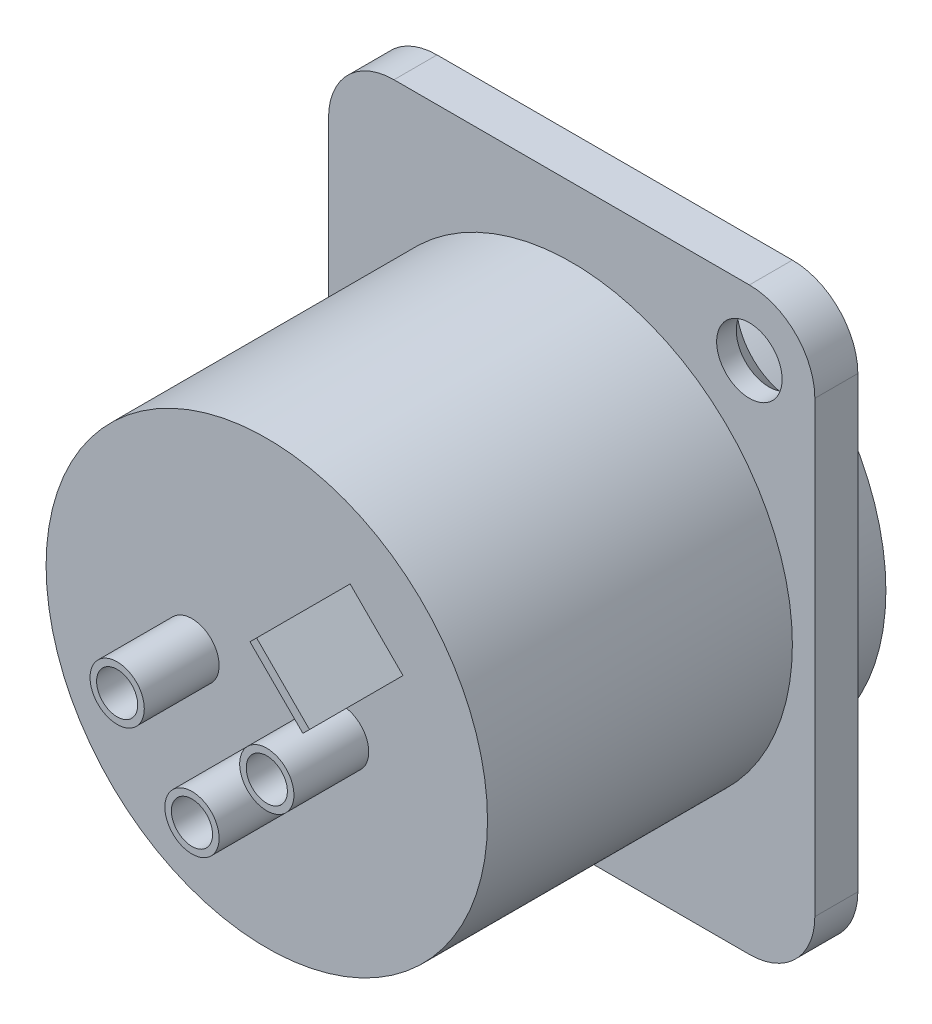
ISO-10303-21;
HEADER;
FILE_DESCRIPTION(('STEP AP214'),'2;1');
FILE_NAME('part.step','',(''),(''),'','','');
FILE_SCHEMA(('AUTOMOTIVE_DESIGN { 1 0 10303 214 1 1 1 1 }'));
ENDSEC;
DATA;
#1=APPLICATION_CONTEXT('core data for automotive mechanical design processes');
#2=APPLICATION_PROTOCOL_DEFINITION('international standard','automotive_design',2000,#1);
#3=PRODUCT_CONTEXT('',#1,'mechanical');
#4=PRODUCT('Part','Part','',(#3));
#5=PRODUCT_RELATED_PRODUCT_CATEGORY('part','',(#4));
#6=PRODUCT_DEFINITION_FORMATION('','',#4);
#7=PRODUCT_DEFINITION_CONTEXT('part definition',#1,'design');
#8=PRODUCT_DEFINITION('design','',#6,#7);
#9=PRODUCT_DEFINITION_SHAPE('','',#8);
#10=(LENGTH_UNIT() NAMED_UNIT(*) SI_UNIT(.MILLI.,.METRE.));
#11=(NAMED_UNIT(*) PLANE_ANGLE_UNIT() SI_UNIT($,.RADIAN.));
#12=(NAMED_UNIT(*) SI_UNIT($,.STERADIAN.) SOLID_ANGLE_UNIT());
#13=UNCERTAINTY_MEASURE_WITH_UNIT(LENGTH_MEASURE(1.E-05),#10,'distance_accuracy_value','');
#14=(GEOMETRIC_REPRESENTATION_CONTEXT(3) GLOBAL_UNCERTAINTY_ASSIGNED_CONTEXT((#13)) GLOBAL_UNIT_ASSIGNED_CONTEXT((#10,
#11,#12)) REPRESENTATION_CONTEXT('',''));
#15=CARTESIAN_POINT('',(0.,0.,0.));
#16=DIRECTION('',(0.,0.,1.));
#17=DIRECTION('',(1.,0.,0.));
#18=AXIS2_PLACEMENT_3D('',#15,#16,#17);
#19=CARTESIAN_POINT('',(0.,0.,18.6));
#20=DIRECTION('',(0.,0.,-1.));
#21=DIRECTION('',(-1.,0.,0.));
#22=AXIS2_PLACEMENT_3D('',#19,#20,#21);
#23=PLANE('',#22);
#24=CARTESIAN_POINT('',(-4.,0.,18.6));
#25=DIRECTION('',(0.,0.,1.));
#26=DIRECTION('',(1.,0.,0.));
#27=AXIS2_PLACEMENT_3D('',#24,#25,#26);
#28=CIRCLE('',#27,1.1);
#29=CARTESIAN_POINT('',(-2.9,0.,18.6));
#30=VERTEX_POINT('',#29);
#31=EDGE_CURVE('E18',#30,#30,#28,.T.);
#32=ORIENTED_EDGE('',*,*,#31,.T.);
#33=EDGE_LOOP('',(#32));
#34=FACE_BOUND('',#33,.T.);
#35=ADVANCED_FACE('F15',(#34),#23,.F.);
#36=CARTESIAN_POINT('',(0.,0.,18.6));
#37=DIRECTION('',(0.,0.,-1.));
#38=DIRECTION('',(-1.,0.,0.));
#39=AXIS2_PLACEMENT_3D('',#36,#37,#38);
#40=PLANE('',#39);
#41=CARTESIAN_POINT('',(0.,-4.,18.6));
#42=DIRECTION('',(0.,0.,1.));
#43=DIRECTION('',(1.,0.,0.));
#44=AXIS2_PLACEMENT_3D('',#41,#42,#43);
#45=CIRCLE('',#44,1.1);
#46=CARTESIAN_POINT('',(1.1,-4.,18.6));
#47=VERTEX_POINT('',#46);
#48=EDGE_CURVE('E272',#47,#47,#45,.T.);
#49=ORIENTED_EDGE('',*,*,#48,.T.);
#50=EDGE_LOOP('',(#49));
#51=FACE_BOUND('',#50,.T.);
#52=ADVANCED_FACE('F294',(#51),#40,.F.);
#53=CARTESIAN_POINT('',(0.,0.,18.6));
#54=DIRECTION('',(0.,0.,-1.));
#55=DIRECTION('',(-1.,0.,0.));
#56=AXIS2_PLACEMENT_3D('',#53,#54,#55);
#57=PLANE('',#56);
#58=CARTESIAN_POINT('',(4.,0.,18.6));
#59=DIRECTION('',(0.,0.,1.));
#60=DIRECTION('',(1.,0.,0.));
#61=AXIS2_PLACEMENT_3D('',#58,#59,#60);
#62=CIRCLE('',#61,1.1);
#63=CARTESIAN_POINT('',(5.1,0.,18.6));
#64=VERTEX_POINT('',#63);
#65=EDGE_CURVE('E157',#64,#64,#62,.T.);
#66=ORIENTED_EDGE('',*,*,#65,.T.);
#67=EDGE_LOOP('',(#66));
#68=FACE_BOUND('',#67,.T.);
#69=ADVANCED_FACE('F283',(#68),#57,.F.);
#70=CARTESIAN_POINT('',(-4.,0.,18.6));
#71=DIRECTION('',(0.,0.,1.));
#72=DIRECTION('',(1.,0.,0.));
#73=AXIS2_PLACEMENT_3D('',#70,#71,#72);
#74=CYLINDRICAL_SURFACE('',#73,1.1);
#75=CARTESIAN_POINT('',(-4.,0.,22.6));
#76=DIRECTION('',(0.,0.,1.));
#77=DIRECTION('',(1.,0.,0.));
#78=AXIS2_PLACEMENT_3D('',#75,#76,#77);
#79=CIRCLE('',#78,1.1);
#80=CARTESIAN_POINT('',(-2.9,0.,22.6));
#81=VERTEX_POINT('',#80);
#82=EDGE_CURVE('E153',#81,#81,#79,.F.);
#83=ORIENTED_EDGE('',*,*,#82,.F.);
#84=EDGE_LOOP('',(#83));
#85=FACE_BOUND('',#84,.T.);
#86=ORIENTED_EDGE('',*,*,#31,.F.);
#87=EDGE_LOOP('',(#86));
#88=FACE_BOUND('',#87,.T.);
#89=ADVANCED_FACE('F280',(#85,#88),#74,.F.);
#90=CARTESIAN_POINT('',(0.,-4.,18.6));
#91=DIRECTION('',(0.,0.,1.));
#92=DIRECTION('',(1.,0.,0.));
#93=AXIS2_PLACEMENT_3D('',#90,#91,#92);
#94=CYLINDRICAL_SURFACE('',#93,1.1);
#95=CARTESIAN_POINT('',(0.,-4.,22.6));
#96=DIRECTION('',(0.,0.,1.));
#97=DIRECTION('',(1.,0.,0.));
#98=AXIS2_PLACEMENT_3D('',#95,#96,#97);
#99=CIRCLE('',#98,1.1);
#100=CARTESIAN_POINT('',(1.1,-4.,22.6));
#101=VERTEX_POINT('',#100);
#102=EDGE_CURVE('E266',#101,#101,#99,.F.);
#103=ORIENTED_EDGE('',*,*,#102,.F.);
#104=EDGE_LOOP('',(#103));
#105=FACE_BOUND('',#104,.T.);
#106=ORIENTED_EDGE('',*,*,#48,.F.);
#107=EDGE_LOOP('',(#106));
#108=FACE_BOUND('',#107,.T.);
#109=ADVANCED_FACE('F282',(#105,#108),#94,.F.);
#110=CARTESIAN_POINT('',(4.,0.,18.6));
#111=DIRECTION('',(0.,0.,1.));
#112=DIRECTION('',(1.,0.,0.));
#113=AXIS2_PLACEMENT_3D('',#110,#111,#112);
#114=CYLINDRICAL_SURFACE('',#113,1.1);
#115=CARTESIAN_POINT('',(4.,0.,22.6));
#116=DIRECTION('',(0.,0.,1.));
#117=DIRECTION('',(1.,0.,0.));
#118=AXIS2_PLACEMENT_3D('',#115,#116,#117);
#119=CIRCLE('',#118,1.1);
#120=CARTESIAN_POINT('',(5.1,0.,22.6));
#121=VERTEX_POINT('',#120);
#122=EDGE_CURVE('E143',#121,#121,#119,.F.);
#123=ORIENTED_EDGE('',*,*,#122,.F.);
#124=EDGE_LOOP('',(#123));
#125=FACE_BOUND('',#124,.T.);
#126=ORIENTED_EDGE('',*,*,#65,.F.);
#127=EDGE_LOOP('',(#126));
#128=FACE_BOUND('',#127,.T.);
#129=ADVANCED_FACE('F291',(#125,#128),#114,.F.);
#130=CARTESIAN_POINT('',(4.454772721475,7.283199846221,18.6));
#131=DIRECTION('',(-0.707106781186548,0.707106781186548,0.));
#132=DIRECTION('',(-0.707106781186548,-0.707106781186548,0.));
#133=AXIS2_PLACEMENT_3D('',#130,#131,#132);
#134=PLANE('',#133);
#135=DIRECTION('',(0.,0.,1.));
#136=VECTOR('',#135,1.);
#137=CARTESIAN_POINT('',(4.454772721475,7.283199846221,18.6));
#138=LINE('',#137,#136);
#139=CARTESIAN_POINT('',(4.454772721475,7.283199846221,18.6));
#140=VERTEX_POINT('',#139);
#141=CARTESIAN_POINT('',(4.454772721475,7.283199846221,23.6));
#142=VERTEX_POINT('',#141);
#143=EDGE_CURVE('E149',#140,#142,#138,.T.);
#144=ORIENTED_EDGE('',*,*,#143,.F.);
#145=DIRECTION('',(-0.707106781186548,-0.707106781186548,0.));
#146=VECTOR('',#145,1.);
#147=CARTESIAN_POINT('',(4.454772721475,7.283199846221,18.6));
#148=LINE('',#147,#146);
#149=CARTESIAN_POINT('',(4.101219330882,6.929646455628,18.6));
#150=VERTEX_POINT('',#149);
#151=EDGE_CURVE('E156',#140,#150,#148,.T.);
#152=ORIENTED_EDGE('',*,*,#151,.T.);
#153=DIRECTION('',(0.,0.,1.));
#154=VECTOR('',#153,1.);
#155=CARTESIAN_POINT('',(4.101219330882,6.929646455628,18.6));
#156=LINE('',#155,#154);
#157=CARTESIAN_POINT('',(4.101219330882,6.929646455628,23.6));
#158=VERTEX_POINT('',#157);
#159=EDGE_CURVE('E147',#158,#150,#156,.F.);
#160=ORIENTED_EDGE('',*,*,#159,.F.);
#161=DIRECTION('',(-0.707106781186547,-0.707106781186548,0.));
#162=VECTOR('',#161,1.);
#163=CARTESIAN_POINT('',(4.454772721475,7.283199846221,23.6));
#164=LINE('',#163,#162);
#165=EDGE_CURVE('E133',#142,#158,#164,.T.);
#166=ORIENTED_EDGE('',*,*,#165,.F.);
#167=EDGE_LOOP('',(#144,#152,#160,#166));
#168=FACE_BOUND('',#167,.T.);
#169=ADVANCED_FACE('F441',(#168),#134,.T.);
#170=CARTESIAN_POINT('',(0.,0.,23.6));
#171=DIRECTION('',(0.,0.,1.));
#172=DIRECTION('',(1.,0.,0.));
#173=AXIS2_PLACEMENT_3D('',#170,#171,#172);
#174=PLANE('',#173);
#175=DIRECTION('',(-0.707106781186548,0.707106781186548,0.));
#176=VECTOR('',#175,1.);
#177=CARTESIAN_POINT('',(7.283199846221,4.454772721475,23.6));
#178=LINE('',#177,#176);
#179=CARTESIAN_POINT('',(7.283199846221,4.454772721475,23.6));
#180=VERTEX_POINT('',#179);
#181=EDGE_CURVE('E473',#142,#180,#178,.F.);
#182=ORIENTED_EDGE('',*,*,#181,.F.);
#183=ORIENTED_EDGE('',*,*,#165,.T.);
#184=DIRECTION('',(0.707106781186548,-0.707106781186548,0.));
#185=VECTOR('',#184,1.);
#186=CARTESIAN_POINT('',(4.101219330882,6.929646455628,23.6));
#187=LINE('',#186,#185);
#188=CARTESIAN_POINT('',(6.929646455628,4.101219330882,23.6));
#189=VERTEX_POINT('',#188);
#190=EDGE_CURVE('E139',#189,#158,#187,.F.);
#191=ORIENTED_EDGE('',*,*,#190,.F.);
#192=DIRECTION('',(0.707106781186548,0.707106781186548,0.));
#193=VECTOR('',#192,1.);
#194=CARTESIAN_POINT('',(6.929646455628,4.101219330882,23.6));
#195=LINE('',#194,#193);
#196=EDGE_CURVE('E124',#180,#189,#195,.F.);
#197=ORIENTED_EDGE('',*,*,#196,.F.);
#198=EDGE_LOOP('',(#182,#183,#191,#197));
#199=FACE_BOUND('',#198,.T.);
#200=ADVANCED_FACE('F145',(#199),#174,.T.);
#201=CARTESIAN_POINT('',(6.929646455628,4.101219330882,18.6));
#202=DIRECTION('',(0.707106781186548,-0.707106781186548,0.));
#203=DIRECTION('',(0.707106781186548,0.707106781186548,0.));
#204=AXIS2_PLACEMENT_3D('',#201,#202,#203);
#205=PLANE('',#204);
#206=DIRECTION('',(0.,0.,1.));
#207=VECTOR('',#206,1.);
#208=CARTESIAN_POINT('',(6.929646455628,4.101219330882,18.6));
#209=LINE('',#208,#207);
#210=CARTESIAN_POINT('',(6.929646455628,4.101219330882,18.6));
#211=VERTEX_POINT('',#210);
#212=EDGE_CURVE('E127',#211,#189,#209,.T.);
#213=ORIENTED_EDGE('',*,*,#212,.F.);
#214=DIRECTION('',(0.707106781186548,0.707106781186548,0.));
#215=VECTOR('',#214,1.);
#216=CARTESIAN_POINT('',(6.929646455628,4.101219330882,18.6));
#217=LINE('',#216,#215);
#218=CARTESIAN_POINT('',(7.283199846221,4.454772721475,18.6));
#219=VERTEX_POINT('',#218);
#220=EDGE_CURVE('E103',#211,#219,#217,.T.);
#221=ORIENTED_EDGE('',*,*,#220,.T.);
#222=DIRECTION('',(0.,0.,1.));
#223=VECTOR('',#222,1.);
#224=CARTESIAN_POINT('',(7.283199846221,4.454772721475,18.6));
#225=LINE('',#224,#223);
#226=EDGE_CURVE('E129',#180,#219,#225,.F.);
#227=ORIENTED_EDGE('',*,*,#226,.F.);
#228=ORIENTED_EDGE('',*,*,#196,.T.);
#229=EDGE_LOOP('',(#213,#221,#227,#228));
#230=FACE_BOUND('',#229,.T.);
#231=ADVANCED_FACE('F126',(#230),#205,.T.);
#232=CARTESIAN_POINT('',(0.,0.,22.6));
#233=DIRECTION('',(0.,0.,1.));
#234=DIRECTION('',(1.,0.,0.));
#235=AXIS2_PLACEMENT_3D('',#232,#233,#234);
#236=PLANE('',#235);
#237=ORIENTED_EDGE('',*,*,#82,.T.);
#238=EDGE_LOOP('',(#237));
#239=FACE_BOUND('',#238,.T.);
#240=CARTESIAN_POINT('',(-4.,0.,22.6));
#241=DIRECTION('',(0.,0.,1.));
#242=DIRECTION('',(1.,0.,0.));
#243=AXIS2_PLACEMENT_3D('',#240,#241,#242);
#244=CIRCLE('',#243,1.45);
#245=CARTESIAN_POINT('',(-2.55,0.,22.6));
#246=VERTEX_POINT('',#245);
#247=EDGE_CURVE('E261',#246,#246,#244,.F.);
#248=ORIENTED_EDGE('',*,*,#247,.F.);
#249=EDGE_LOOP('',(#248));
#250=FACE_BOUND('',#249,.T.);
#251=ADVANCED_FACE('F432',(#239,#250),#236,.T.);
#252=CARTESIAN_POINT('',(0.,0.,22.6));
#253=DIRECTION('',(0.,0.,1.));
#254=DIRECTION('',(1.,0.,0.));
#255=AXIS2_PLACEMENT_3D('',#252,#253,#254);
#256=PLANE('',#255);
#257=ORIENTED_EDGE('',*,*,#102,.T.);
#258=EDGE_LOOP('',(#257));
#259=FACE_BOUND('',#258,.T.);
#260=CARTESIAN_POINT('',(0.,-4.,22.6));
#261=DIRECTION('',(0.,0.,1.));
#262=DIRECTION('',(1.,0.,0.));
#263=AXIS2_PLACEMENT_3D('',#260,#261,#262);
#264=CIRCLE('',#263,1.45);
#265=CARTESIAN_POINT('',(1.45,-4.,22.6));
#266=VERTEX_POINT('',#265);
#267=EDGE_CURVE('E258',#266,#266,#264,.F.);
#268=ORIENTED_EDGE('',*,*,#267,.F.);
#269=EDGE_LOOP('',(#268));
#270=FACE_BOUND('',#269,.T.);
#271=ADVANCED_FACE('F428',(#259,#270),#256,.T.);
#272=CARTESIAN_POINT('',(0.,0.,22.6));
#273=DIRECTION('',(0.,0.,1.));
#274=DIRECTION('',(1.,0.,0.));
#275=AXIS2_PLACEMENT_3D('',#272,#273,#274);
#276=PLANE('',#275);
#277=ORIENTED_EDGE('',*,*,#122,.T.);
#278=EDGE_LOOP('',(#277));
#279=FACE_BOUND('',#278,.T.);
#280=CARTESIAN_POINT('',(4.,0.,22.6));
#281=DIRECTION('',(0.,0.,1.));
#282=DIRECTION('',(1.,0.,0.));
#283=AXIS2_PLACEMENT_3D('',#280,#281,#282);
#284=CIRCLE('',#283,1.45);
#285=CARTESIAN_POINT('',(5.45,0.,22.6));
#286=VERTEX_POINT('',#285);
#287=EDGE_CURVE('E255',#286,#286,#284,.F.);
#288=ORIENTED_EDGE('',*,*,#287,.F.);
#289=EDGE_LOOP('',(#288));
#290=FACE_BOUND('',#289,.T.);
#291=ADVANCED_FACE('F425',(#279,#290),#276,.T.);
#292=CARTESIAN_POINT('',(4.101219330882,6.929646455628,18.6));
#293=DIRECTION('',(-0.707106781186548,-0.707106781186548,0.));
#294=DIRECTION('',(0.707106781186548,-0.707106781186548,0.));
#295=AXIS2_PLACEMENT_3D('',#292,#293,#294);
#296=PLANE('',#295);
#297=ORIENTED_EDGE('',*,*,#159,.T.);
#298=DIRECTION('',(0.707106781186548,-0.707106781186548,0.));
#299=VECTOR('',#298,1.);
#300=CARTESIAN_POINT('',(4.101219330882,6.929646455628,18.6));
#301=LINE('',#300,#299);
#302=EDGE_CURVE('E142',#150,#211,#301,.T.);
#303=ORIENTED_EDGE('',*,*,#302,.T.);
#304=ORIENTED_EDGE('',*,*,#212,.T.);
#305=ORIENTED_EDGE('',*,*,#190,.T.);
#306=EDGE_LOOP('',(#297,#303,#304,#305));
#307=FACE_BOUND('',#306,.T.);
#308=ADVANCED_FACE('F138',(#307),#296,.T.);
#309=CARTESIAN_POINT('',(7.283199846221,4.454772721475,18.6));
#310=DIRECTION('',(0.707106781186548,0.707106781186548,0.));
#311=DIRECTION('',(-0.707106781186548,0.707106781186548,0.));
#312=AXIS2_PLACEMENT_3D('',#309,#310,#311);
#313=PLANE('',#312);
#314=ORIENTED_EDGE('',*,*,#226,.T.);
#315=DIRECTION('',(-0.707106781186547,0.707106781186547,0.));
#316=VECTOR('',#315,1.);
#317=CARTESIAN_POINT('',(7.283199846221,4.454772721475,18.6));
#318=LINE('',#317,#316);
#319=EDGE_CURVE('E254',#219,#140,#318,.T.);
#320=ORIENTED_EDGE('',*,*,#319,.T.);
#321=ORIENTED_EDGE('',*,*,#143,.T.);
#322=ORIENTED_EDGE('',*,*,#181,.T.);
#323=EDGE_LOOP('',(#314,#320,#321,#322));
#324=FACE_BOUND('',#323,.T.);
#325=ADVANCED_FACE('F418',(#324),#313,.T.);
#326=CARTESIAN_POINT('',(-4.,0.,18.6));
#327=DIRECTION('',(0.,0.,1.));
#328=DIRECTION('',(1.,0.,0.));
#329=AXIS2_PLACEMENT_3D('',#326,#327,#328);
#330=CYLINDRICAL_SURFACE('',#329,1.45);
#331=ORIENTED_EDGE('',*,*,#247,.T.);
#332=EDGE_LOOP('',(#331));
#333=FACE_BOUND('',#332,.T.);
#334=CARTESIAN_POINT('',(-4.,0.,18.6));
#335=DIRECTION('',(0.,0.,1.));
#336=DIRECTION('',(1.,0.,0.));
#337=AXIS2_PLACEMENT_3D('',#334,#335,#336);
#338=CIRCLE('',#337,1.45);
#339=CARTESIAN_POINT('',(-2.55,0.,18.6));
#340=VERTEX_POINT('',#339);
#341=EDGE_CURVE('E251',#340,#340,#338,.T.);
#342=ORIENTED_EDGE('',*,*,#341,.T.);
#343=EDGE_LOOP('',(#342));
#344=FACE_BOUND('',#343,.T.);
#345=ADVANCED_FACE('F414',(#333,#344),#330,.T.);
#346=CARTESIAN_POINT('',(0.,-4.,18.6));
#347=DIRECTION('',(0.,0.,1.));
#348=DIRECTION('',(1.,0.,0.));
#349=AXIS2_PLACEMENT_3D('',#346,#347,#348);
#350=CYLINDRICAL_SURFACE('',#349,1.45);
#351=ORIENTED_EDGE('',*,*,#267,.T.);
#352=EDGE_LOOP('',(#351));
#353=FACE_BOUND('',#352,.T.);
#354=CARTESIAN_POINT('',(0.,-4.,18.6));
#355=DIRECTION('',(0.,0.,1.));
#356=DIRECTION('',(1.,0.,0.));
#357=AXIS2_PLACEMENT_3D('',#354,#355,#356);
#358=CIRCLE('',#357,1.45);
#359=CARTESIAN_POINT('',(1.45,-4.,18.6));
#360=VERTEX_POINT('',#359);
#361=EDGE_CURVE('E248',#360,#360,#358,.T.);
#362=ORIENTED_EDGE('',*,*,#361,.T.);
#363=EDGE_LOOP('',(#362));
#364=FACE_BOUND('',#363,.T.);
#365=ADVANCED_FACE('F410',(#353,#364),#350,.T.);
#366=CARTESIAN_POINT('',(4.,0.,18.6));
#367=DIRECTION('',(0.,0.,1.));
#368=DIRECTION('',(1.,0.,0.));
#369=AXIS2_PLACEMENT_3D('',#366,#367,#368);
#370=CYLINDRICAL_SURFACE('',#369,1.45);
#371=ORIENTED_EDGE('',*,*,#287,.T.);
#372=EDGE_LOOP('',(#371));
#373=FACE_BOUND('',#372,.T.);
#374=CARTESIAN_POINT('',(4.,0.,18.6));
#375=DIRECTION('',(0.,0.,1.));
#376=DIRECTION('',(1.,0.,0.));
#377=AXIS2_PLACEMENT_3D('',#374,#375,#376);
#378=CIRCLE('',#377,1.45);
#379=CARTESIAN_POINT('',(5.45,0.,18.6));
#380=VERTEX_POINT('',#379);
#381=EDGE_CURVE('E245',#380,#380,#378,.T.);
#382=ORIENTED_EDGE('',*,*,#381,.T.);
#383=EDGE_LOOP('',(#382));
#384=FACE_BOUND('',#383,.T.);
#385=ADVANCED_FACE('F406',(#373,#384),#370,.T.);
#386=CARTESIAN_POINT('',(0.,0.,18.6));
#387=DIRECTION('',(0.,0.,-1.));
#388=DIRECTION('',(-1.,0.,0.));
#389=AXIS2_PLACEMENT_3D('',#386,#387,#388);
#390=PLANE('',#389);
#391=ORIENTED_EDGE('',*,*,#381,.F.);
#392=EDGE_LOOP('',(#391));
#393=FACE_BOUND('',#392,.T.);
#394=ORIENTED_EDGE('',*,*,#361,.F.);
#395=EDGE_LOOP('',(#394));
#396=FACE_BOUND('',#395,.T.);
#397=ORIENTED_EDGE('',*,*,#341,.F.);
#398=EDGE_LOOP('',(#397));
#399=FACE_BOUND('',#398,.T.);
#400=ORIENTED_EDGE('',*,*,#220,.F.);
#401=ORIENTED_EDGE('',*,*,#302,.F.);
#402=ORIENTED_EDGE('',*,*,#151,.F.);
#403=ORIENTED_EDGE('',*,*,#319,.F.);
#404=EDGE_LOOP('',(#400,#401,#402,#403));
#405=FACE_BOUND('',#404,.T.);
#406=CARTESIAN_POINT('',(0.,0.,18.6));
#407=DIRECTION('',(0.,0.,-1.));
#408=DIRECTION('',(-1.,0.,0.));
#409=AXIS2_PLACEMENT_3D('',#406,#407,#408);
#410=CIRCLE('',#409,11.8);
#411=CARTESIAN_POINT('',(-11.8,0.,18.6));
#412=VERTEX_POINT('',#411);
#413=EDGE_CURVE('E242',#412,#412,#410,.T.);
#414=ORIENTED_EDGE('',*,*,#413,.F.);
#415=EDGE_LOOP('',(#414));
#416=FACE_BOUND('',#415,.T.);
#417=ADVANCED_FACE('F402',(#393,#396,#399,#405,#416),#390,.F.);
#418=CARTESIAN_POINT('',(0.,0.,18.6));
#419=DIRECTION('',(0.,0.,-1.));
#420=DIRECTION('',(-1.,0.,0.));
#421=AXIS2_PLACEMENT_3D('',#418,#419,#420);
#422=CYLINDRICAL_SURFACE('',#421,11.8);
#423=CARTESIAN_POINT('',(0.,0.,2.3));
#424=DIRECTION('',(0.,0.,-1.));
#425=DIRECTION('',(-1.,0.,0.));
#426=AXIS2_PLACEMENT_3D('',#423,#424,#425);
#427=CIRCLE('',#426,11.8);
#428=CARTESIAN_POINT('',(-11.8,0.,2.3));
#429=VERTEX_POINT('',#428);
#430=EDGE_CURVE('E239',#429,#429,#427,.T.);
#431=ORIENTED_EDGE('',*,*,#430,.F.);
#432=EDGE_LOOP('',(#431));
#433=FACE_BOUND('',#432,.T.);
#434=ORIENTED_EDGE('',*,*,#413,.T.);
#435=EDGE_LOOP('',(#434));
#436=FACE_BOUND('',#435,.T.);
#437=ADVANCED_FACE('F398',(#433,#436),#422,.T.);
#438=CARTESIAN_POINT('',(0.,0.,2.3));
#439=DIRECTION('',(0.,0.,1.));
#440=DIRECTION('',(1.,0.,0.));
#441=AXIS2_PLACEMENT_3D('',#438,#439,#440);
#442=PLANE('',#441);
#443=ORIENTED_EDGE('',*,*,#430,.T.);
#444=EDGE_LOOP('',(#443));
#445=FACE_BOUND('',#444,.T.);
#446=CARTESIAN_POINT('',(-9.5,-12.,2.3));
#447=DIRECTION('',(0.,0.,1.));
#448=DIRECTION('',(1.,0.,0.));
#449=AXIS2_PLACEMENT_3D('',#446,#447,#448);
#450=CIRCLE('',#449,1.75);
#451=CARTESIAN_POINT('',(-7.75,-12.,2.3));
#452=VERTEX_POINT('',#451);
#453=EDGE_CURVE('E233',#452,#452,#450,.F.);
#454=ORIENTED_EDGE('',*,*,#453,.T.);
#455=EDGE_LOOP('',(#454));
#456=FACE_BOUND('',#455,.T.);
#457=CARTESIAN_POINT('',(9.5,12.,2.3));
#458=DIRECTION('',(0.,0.,1.));
#459=DIRECTION('',(1.,0.,0.));
#460=AXIS2_PLACEMENT_3D('',#457,#458,#459);
#461=CIRCLE('',#460,1.75);
#462=CARTESIAN_POINT('',(11.25,12.,2.3));
#463=VERTEX_POINT('',#462);
#464=EDGE_CURVE('E236',#463,#463,#461,.F.);
#465=ORIENTED_EDGE('',*,*,#464,.T.);
#466=EDGE_LOOP('',(#465));
#467=FACE_BOUND('',#466,.T.);
#468=CARTESIAN_POINT('',(-9.5,12.,2.3));
#469=DIRECTION('',(0.,0.,1.));
#470=DIRECTION('',(1.,0.,0.));
#471=AXIS2_PLACEMENT_3D('',#468,#469,#470);
#472=CIRCLE('',#471,3.5);
#473=CARTESIAN_POINT('',(-13.,12.,2.3));
#474=VERTEX_POINT('',#473);
#475=CARTESIAN_POINT('',(-9.5,15.5,2.3));
#476=VERTEX_POINT('',#475);
#477=EDGE_CURVE('E219',#474,#476,#472,.F.);
#478=ORIENTED_EDGE('',*,*,#477,.F.);
#479=DIRECTION('',(0.,1.,0.));
#480=VECTOR('',#479,1.);
#481=CARTESIAN_POINT('',(-13.,12.,2.3));
#482=LINE('',#481,#480);
#483=CARTESIAN_POINT('',(-13.,-12.,2.3));
#484=VERTEX_POINT('',#483);
#485=EDGE_CURVE('E232',#484,#474,#482,.T.);
#486=ORIENTED_EDGE('',*,*,#485,.F.);
#487=CARTESIAN_POINT('',(-9.5,-12.,2.3));
#488=DIRECTION('',(0.,0.,1.));
#489=DIRECTION('',(1.,0.,0.));
#490=AXIS2_PLACEMENT_3D('',#487,#488,#489);
#491=CIRCLE('',#490,3.5);
#492=CARTESIAN_POINT('',(-9.5,-15.5,2.3));
#493=VERTEX_POINT('',#492);
#494=EDGE_CURVE('E94',#493,#484,#491,.F.);
#495=ORIENTED_EDGE('',*,*,#494,.F.);
#496=DIRECTION('',(1.,0.,0.));
#497=VECTOR('',#496,1.);
#498=CARTESIAN_POINT('',(-9.5,-15.5,2.3));
#499=LINE('',#498,#497);
#500=CARTESIAN_POINT('',(9.5,-15.5,2.3));
#501=VERTEX_POINT('',#500);
#502=EDGE_CURVE('E88',#501,#493,#499,.F.);
#503=ORIENTED_EDGE('',*,*,#502,.F.);
#504=CARTESIAN_POINT('',(9.5,-12.,2.3));
#505=DIRECTION('',(0.,0.,1.));
#506=DIRECTION('',(1.,0.,0.));
#507=AXIS2_PLACEMENT_3D('',#504,#505,#506);
#508=CIRCLE('',#507,3.5);
#509=CARTESIAN_POINT('',(13.,-12.,2.3));
#510=VERTEX_POINT('',#509);
#511=EDGE_CURVE('E226',#510,#501,#508,.F.);
#512=ORIENTED_EDGE('',*,*,#511,.F.);
#513=DIRECTION('',(0.,1.,0.));
#514=VECTOR('',#513,1.);
#515=CARTESIAN_POINT('',(13.,-12.,2.3));
#516=LINE('',#515,#514);
#517=CARTESIAN_POINT('',(13.,12.,2.3));
#518=VERTEX_POINT('',#517);
#519=EDGE_CURVE('E474',#518,#510,#516,.F.);
#520=ORIENTED_EDGE('',*,*,#519,.F.);
#521=CARTESIAN_POINT('',(9.5,12.,2.3));
#522=DIRECTION('',(0.,0.,1.));
#523=DIRECTION('',(1.,0.,0.));
#524=AXIS2_PLACEMENT_3D('',#521,#522,#523);
#525=CIRCLE('',#524,3.5);
#526=CARTESIAN_POINT('',(9.5,15.5,2.3));
#527=VERTEX_POINT('',#526);
#528=EDGE_CURVE('E222',#527,#518,#525,.F.);
#529=ORIENTED_EDGE('',*,*,#528,.F.);
#530=DIRECTION('',(1.,0.,0.));
#531=VECTOR('',#530,1.);
#532=CARTESIAN_POINT('',(9.5,15.5,2.3));
#533=LINE('',#532,#531);
#534=EDGE_CURVE('E477',#476,#527,#533,.T.);
#535=ORIENTED_EDGE('',*,*,#534,.F.);
#536=EDGE_LOOP('',(#478,#486,#495,#503,#512,#520,#529,#535));
#537=FACE_BOUND('',#536,.T.);
#538=ADVANCED_FACE('F394',(#445,#456,#467,#537),#442,.T.);
#539=CARTESIAN_POINT('',(9.5,12.,0.));
#540=DIRECTION('',(0.,0.,1.));
#541=DIRECTION('',(1.,0.,0.));
#542=AXIS2_PLACEMENT_3D('',#539,#540,#541);
#543=CYLINDRICAL_SURFACE('',#542,1.75);
#544=ORIENTED_EDGE('',*,*,#464,.F.);
#545=EDGE_LOOP('',(#544));
#546=FACE_BOUND('',#545,.T.);
#547=CARTESIAN_POINT('',(9.5,12.,1.24998391103681));
#548=DIRECTION('',(0.,0.,-1.));
#549=DIRECTION('',(-1.,0.,0.));
#550=AXIS2_PLACEMENT_3D('',#547,#548,#549);
#551=CIRCLE('',#550,1.75);
#552=CARTESIAN_POINT('',(7.75,12.,1.24998391103681));
#553=VERTEX_POINT('',#552);
#554=EDGE_CURVE('E215',#553,#553,#551,.T.);
#555=ORIENTED_EDGE('',*,*,#554,.T.);
#556=EDGE_LOOP('',(#555));
#557=FACE_BOUND('',#556,.T.);
#558=ADVANCED_FACE('F390',(#546,#557),#543,.F.);
#559=CARTESIAN_POINT('',(-9.5,-12.,0.));
#560=DIRECTION('',(0.,0.,1.));
#561=DIRECTION('',(1.,0.,0.));
#562=AXIS2_PLACEMENT_3D('',#559,#560,#561);
#563=CYLINDRICAL_SURFACE('',#562,1.75);
#564=ORIENTED_EDGE('',*,*,#453,.F.);
#565=EDGE_LOOP('',(#564));
#566=FACE_BOUND('',#565,.T.);
#567=CARTESIAN_POINT('',(-9.5,-12.,1.24998391103772));
#568=DIRECTION('',(0.,0.,-1.));
#569=DIRECTION('',(-1.,0.,0.));
#570=AXIS2_PLACEMENT_3D('',#567,#568,#569);
#571=CIRCLE('',#570,1.75);
#572=CARTESIAN_POINT('',(-11.25,-12.,1.24998391103772));
#573=VERTEX_POINT('',#572);
#574=EDGE_CURVE('E212',#573,#573,#571,.T.);
#575=ORIENTED_EDGE('',*,*,#574,.T.);
#576=EDGE_LOOP('',(#575));
#577=FACE_BOUND('',#576,.T.);
#578=ADVANCED_FACE('F386',(#566,#577),#563,.F.);
#579=CARTESIAN_POINT('',(-13.,12.,0.));
#580=DIRECTION('',(-1.,0.,0.));
#581=DIRECTION('',(0.,0.,1.));
#582=AXIS2_PLACEMENT_3D('',#579,#580,#581);
#583=PLANE('',#582);
#584=DIRECTION('',(0.,0.,1.));
#585=VECTOR('',#584,1.);
#586=CARTESIAN_POINT('',(-13.,12.,0.));
#587=LINE('',#586,#585);
#588=CARTESIAN_POINT('',(-13.,12.,0.));
#589=VERTEX_POINT('',#588);
#590=EDGE_CURVE('E221',#589,#474,#587,.T.);
#591=ORIENTED_EDGE('',*,*,#590,.F.);
#592=DIRECTION('',(0.,1.,0.));
#593=VECTOR('',#592,1.);
#594=CARTESIAN_POINT('',(-13.,0.,0.));
#595=LINE('',#594,#593);
#596=CARTESIAN_POINT('',(-13.,-12.,0.));
#597=VERTEX_POINT('',#596);
#598=EDGE_CURVE('E211',#589,#597,#595,.F.);
#599=ORIENTED_EDGE('',*,*,#598,.T.);
#600=DIRECTION('',(0.,0.,1.));
#601=VECTOR('',#600,1.);
#602=CARTESIAN_POINT('',(-13.,-12.,0.));
#603=LINE('',#602,#601);
#604=EDGE_CURVE('E231',#484,#597,#603,.F.);
#605=ORIENTED_EDGE('',*,*,#604,.F.);
#606=ORIENTED_EDGE('',*,*,#485,.T.);
#607=EDGE_LOOP('',(#591,#599,#605,#606));
#608=FACE_BOUND('',#607,.T.);
#609=ADVANCED_FACE('F383',(#608),#583,.T.);
#610=CARTESIAN_POINT('',(-9.5,-12.,0.));
#611=DIRECTION('',(0.,0.,1.));
#612=DIRECTION('',(1.,0.,0.));
#613=AXIS2_PLACEMENT_3D('',#610,#611,#612);
#614=CYLINDRICAL_SURFACE('',#613,3.5);
#615=ORIENTED_EDGE('',*,*,#604,.T.);
#616=CARTESIAN_POINT('',(-9.5,-12.,0.));
#617=DIRECTION('',(0.,0.,1.));
#618=DIRECTION('',(1.,0.,0.));
#619=AXIS2_PLACEMENT_3D('',#616,#617,#618);
#620=CIRCLE('',#619,3.5);
#621=CARTESIAN_POINT('',(-9.5,-15.5,0.));
#622=VERTEX_POINT('',#621);
#623=EDGE_CURVE('E208',#597,#622,#620,.T.);
#624=ORIENTED_EDGE('',*,*,#623,.T.);
#625=DIRECTION('',(0.,0.,-1.));
#626=VECTOR('',#625,1.);
#627=CARTESIAN_POINT('',(-9.5,-15.5,0.));
#628=LINE('',#627,#626);
#629=EDGE_CURVE('E229',#493,#622,#628,.T.);
#630=ORIENTED_EDGE('',*,*,#629,.F.);
#631=ORIENTED_EDGE('',*,*,#494,.T.);
#632=EDGE_LOOP('',(#615,#624,#630,#631));
#633=FACE_BOUND('',#632,.T.);
#634=ADVANCED_FACE('F380',(#633),#614,.T.);
#635=CARTESIAN_POINT('',(-9.5,-15.5,0.));
#636=DIRECTION('',(0.,-1.,0.));
#637=DIRECTION('',(0.,0.,-1.));
#638=AXIS2_PLACEMENT_3D('',#635,#636,#637);
#639=PLANE('',#638);
#640=ORIENTED_EDGE('',*,*,#629,.T.);
#641=DIRECTION('',(1.,0.,0.));
#642=VECTOR('',#641,1.);
#643=CARTESIAN_POINT('',(0.,-15.5,0.));
#644=LINE('',#643,#642);
#645=CARTESIAN_POINT('',(9.5,-15.5,0.));
#646=VERTEX_POINT('',#645);
#647=EDGE_CURVE('E207',#622,#646,#644,.T.);
#648=ORIENTED_EDGE('',*,*,#647,.T.);
#649=DIRECTION('',(0.,0.,1.));
#650=VECTOR('',#649,1.);
#651=CARTESIAN_POINT('',(9.5,-15.5,0.));
#652=LINE('',#651,#650);
#653=EDGE_CURVE('E228',#501,#646,#652,.F.);
#654=ORIENTED_EDGE('',*,*,#653,.F.);
#655=ORIENTED_EDGE('',*,*,#502,.T.);
#656=EDGE_LOOP('',(#640,#648,#654,#655));
#657=FACE_BOUND('',#656,.T.);
#658=ADVANCED_FACE('F376',(#657),#639,.T.);
#659=CARTESIAN_POINT('',(9.5,-12.,0.));
#660=DIRECTION('',(0.,0.,1.));
#661=DIRECTION('',(1.,0.,0.));
#662=AXIS2_PLACEMENT_3D('',#659,#660,#661);
#663=CYLINDRICAL_SURFACE('',#662,3.5);
#664=ORIENTED_EDGE('',*,*,#653,.T.);
#665=CARTESIAN_POINT('',(9.5,-12.,0.));
#666=DIRECTION('',(0.,0.,1.));
#667=DIRECTION('',(1.,0.,0.));
#668=AXIS2_PLACEMENT_3D('',#665,#666,#667);
#669=CIRCLE('',#668,3.5);
#670=CARTESIAN_POINT('',(13.,-12.,0.));
#671=VERTEX_POINT('',#670);
#672=EDGE_CURVE('E204',#646,#671,#669,.T.);
#673=ORIENTED_EDGE('',*,*,#672,.T.);
#674=DIRECTION('',(0.,0.,-1.));
#675=VECTOR('',#674,1.);
#676=CARTESIAN_POINT('',(13.,-12.,0.));
#677=LINE('',#676,#675);
#678=EDGE_CURVE('E225',#510,#671,#677,.T.);
#679=ORIENTED_EDGE('',*,*,#678,.F.);
#680=ORIENTED_EDGE('',*,*,#511,.T.);
#681=EDGE_LOOP('',(#664,#673,#679,#680));
#682=FACE_BOUND('',#681,.T.);
#683=ADVANCED_FACE('F372',(#682),#663,.T.);
#684=CARTESIAN_POINT('',(13.,-12.,0.));
#685=DIRECTION('',(1.,0.,0.));
#686=DIRECTION('',(0.,0.,-1.));
#687=AXIS2_PLACEMENT_3D('',#684,#685,#686);
#688=PLANE('',#687);
#689=ORIENTED_EDGE('',*,*,#678,.T.);
#690=DIRECTION('',(0.,1.,0.));
#691=VECTOR('',#690,1.);
#692=CARTESIAN_POINT('',(13.,0.,0.));
#693=LINE('',#692,#691);
#694=CARTESIAN_POINT('',(13.,12.,0.));
#695=VERTEX_POINT('',#694);
#696=EDGE_CURVE('E203',#671,#695,#693,.T.);
#697=ORIENTED_EDGE('',*,*,#696,.T.);
#698=DIRECTION('',(0.,0.,1.));
#699=VECTOR('',#698,1.);
#700=CARTESIAN_POINT('',(13.,12.,0.));
#701=LINE('',#700,#699);
#702=EDGE_CURVE('E224',#518,#695,#701,.F.);
#703=ORIENTED_EDGE('',*,*,#702,.F.);
#704=ORIENTED_EDGE('',*,*,#519,.T.);
#705=EDGE_LOOP('',(#689,#697,#703,#704));
#706=FACE_BOUND('',#705,.T.);
#707=ADVANCED_FACE('F368',(#706),#688,.T.);
#708=CARTESIAN_POINT('',(9.5,12.,0.));
#709=DIRECTION('',(0.,0.,1.));
#710=DIRECTION('',(1.,0.,0.));
#711=AXIS2_PLACEMENT_3D('',#708,#709,#710);
#712=CYLINDRICAL_SURFACE('',#711,3.5);
#713=ORIENTED_EDGE('',*,*,#702,.T.);
#714=CARTESIAN_POINT('',(9.5,12.,0.));
#715=DIRECTION('',(0.,0.,1.));
#716=DIRECTION('',(1.,0.,0.));
#717=AXIS2_PLACEMENT_3D('',#714,#715,#716);
#718=CIRCLE('',#717,3.5);
#719=CARTESIAN_POINT('',(9.5,15.5,0.));
#720=VERTEX_POINT('',#719);
#721=EDGE_CURVE('E200',#695,#720,#718,.T.);
#722=ORIENTED_EDGE('',*,*,#721,.T.);
#723=DIRECTION('',(0.,0.,1.));
#724=VECTOR('',#723,1.);
#725=CARTESIAN_POINT('',(9.5,15.5,0.));
#726=LINE('',#725,#724);
#727=EDGE_CURVE('E479',#527,#720,#726,.F.);
#728=ORIENTED_EDGE('',*,*,#727,.F.);
#729=ORIENTED_EDGE('',*,*,#528,.T.);
#730=EDGE_LOOP('',(#713,#722,#728,#729));
#731=FACE_BOUND('',#730,.T.);
#732=ADVANCED_FACE('F364',(#731),#712,.T.);
#733=CARTESIAN_POINT('',(9.5,15.5,0.));
#734=DIRECTION('',(0.,1.,0.));
#735=DIRECTION('',(0.,0.,1.));
#736=AXIS2_PLACEMENT_3D('',#733,#734,#735);
#737=PLANE('',#736);
#738=ORIENTED_EDGE('',*,*,#727,.T.);
#739=DIRECTION('',(1.,0.,0.));
#740=VECTOR('',#739,1.);
#741=CARTESIAN_POINT('',(0.,15.5,0.));
#742=LINE('',#741,#740);
#743=CARTESIAN_POINT('',(-9.5,15.5,0.));
#744=VERTEX_POINT('',#743);
#745=EDGE_CURVE('E199',#720,#744,#742,.F.);
#746=ORIENTED_EDGE('',*,*,#745,.T.);
#747=DIRECTION('',(0.,0.,1.));
#748=VECTOR('',#747,1.);
#749=CARTESIAN_POINT('',(-9.5,15.5,0.));
#750=LINE('',#749,#748);
#751=EDGE_CURVE('E218',#476,#744,#750,.F.);
#752=ORIENTED_EDGE('',*,*,#751,.F.);
#753=ORIENTED_EDGE('',*,*,#534,.T.);
#754=EDGE_LOOP('',(#738,#746,#752,#753));
#755=FACE_BOUND('',#754,.T.);
#756=ADVANCED_FACE('F360',(#755),#737,.T.);
#757=CARTESIAN_POINT('',(-9.5,12.,0.));
#758=DIRECTION('',(0.,0.,1.));
#759=DIRECTION('',(1.,0.,0.));
#760=AXIS2_PLACEMENT_3D('',#757,#758,#759);
#761=CYLINDRICAL_SURFACE('',#760,3.5);
#762=ORIENTED_EDGE('',*,*,#751,.T.);
#763=CARTESIAN_POINT('',(-9.5,12.,0.));
#764=DIRECTION('',(0.,0.,1.));
#765=DIRECTION('',(1.,0.,0.));
#766=AXIS2_PLACEMENT_3D('',#763,#764,#765);
#767=CIRCLE('',#766,3.5);
#768=EDGE_CURVE('E196',#744,#589,#767,.T.);
#769=ORIENTED_EDGE('',*,*,#768,.T.);
#770=ORIENTED_EDGE('',*,*,#590,.T.);
#771=ORIENTED_EDGE('',*,*,#477,.T.);
#772=EDGE_LOOP('',(#762,#769,#770,#771));
#773=FACE_BOUND('',#772,.T.);
#774=ADVANCED_FACE('F356',(#773),#761,.T.);
#775=CARTESIAN_POINT('',(9.5,12.,-8.3037434706057E-06));
#776=DIRECTION('',(0.,0.,-1.));
#777=DIRECTION('',(-1.,0.,0.));
#778=AXIS2_PLACEMENT_3D('',#775,#776,#777);
#779=CONICAL_SURFACE('',#778,2.99998072284734,0.785393566574511);
#780=ORIENTED_EDGE('',*,*,#554,.F.);
#781=EDGE_LOOP('',(#780));
#782=FACE_BOUND('',#781,.T.);
#783=CARTESIAN_POINT('',(9.5,12.,0.));
#784=DIRECTION('',(0.,0.,1.));
#785=DIRECTION('',(1.,0.,0.));
#786=AXIS2_PLACEMENT_3D('',#783,#784,#785);
#787=CIRCLE('',#786,2.99997241918021);
#788=CARTESIAN_POINT('',(12.4999724191802,12.,0.));
#789=VERTEX_POINT('',#788);
#790=EDGE_CURVE('E193',#789,#789,#787,.F.);
#791=ORIENTED_EDGE('',*,*,#790,.T.);
#792=EDGE_LOOP('',(#791));
#793=FACE_BOUND('',#792,.T.);
#794=ADVANCED_FACE('F352',(#782,#793),#779,.F.);
#795=CARTESIAN_POINT('',(-9.5,-12.,-8.3037434706057E-06));
#796=DIRECTION('',(0.,0.,-1.));
#797=DIRECTION('',(-1.,0.,0.));
#798=AXIS2_PLACEMENT_3D('',#795,#796,#797);
#799=CONICAL_SURFACE('',#798,2.99998072279141,0.785393566551773);
#800=ORIENTED_EDGE('',*,*,#574,.F.);
#801=EDGE_LOOP('',(#800));
#802=FACE_BOUND('',#801,.T.);
#803=CARTESIAN_POINT('',(-9.5,-12.,0.));
#804=DIRECTION('',(0.,0.,1.));
#805=DIRECTION('',(1.,0.,0.));
#806=AXIS2_PLACEMENT_3D('',#803,#804,#805);
#807=CIRCLE('',#806,2.99997241912428);
#808=CARTESIAN_POINT('',(-6.50002758087572,-12.,0.));
#809=VERTEX_POINT('',#808);
#810=EDGE_CURVE('E190',#809,#809,#807,.F.);
#811=ORIENTED_EDGE('',*,*,#810,.T.);
#812=EDGE_LOOP('',(#811));
#813=FACE_BOUND('',#812,.T.);
#814=ADVANCED_FACE('F348',(#802,#813),#799,.F.);
#815=CARTESIAN_POINT('',(0.,0.,-2.7));
#816=DIRECTION('',(0.,0.,-1.));
#817=DIRECTION('',(-1.,0.,0.));
#818=AXIS2_PLACEMENT_3D('',#815,#816,#817);
#819=PLANE('',#818);
#820=CARTESIAN_POINT('',(4.,0.,-2.7));
#821=DIRECTION('',(0.,0.,-1.));
#822=DIRECTION('',(-1.,0.,0.));
#823=AXIS2_PLACEMENT_3D('',#820,#821,#822);
#824=CIRCLE('',#823,1.19);
#825=CARTESIAN_POINT('',(2.81,0.,-2.7));
#826=VERTEX_POINT('',#825);
#827=EDGE_CURVE('E187',#826,#826,#824,.F.);
#828=ORIENTED_EDGE('',*,*,#827,.F.);
#829=EDGE_LOOP('',(#828));
#830=FACE_BOUND('',#829,.T.);
#831=ADVANCED_FACE('F344',(#830),#819,.T.);
#832=CARTESIAN_POINT('',(0.,0.,-2.7));
#833=DIRECTION('',(0.,0.,-1.));
#834=DIRECTION('',(-1.,0.,0.));
#835=AXIS2_PLACEMENT_3D('',#832,#833,#834);
#836=PLANE('',#835);
#837=CARTESIAN_POINT('',(0.,-4.,-2.7));
#838=DIRECTION('',(0.,0.,-1.));
#839=DIRECTION('',(-1.,0.,0.));
#840=AXIS2_PLACEMENT_3D('',#837,#838,#839);
#841=CIRCLE('',#840,1.19);
#842=CARTESIAN_POINT('',(-1.19,-4.,-2.7));
#843=VERTEX_POINT('',#842);
#844=EDGE_CURVE('E184',#843,#843,#841,.F.);
#845=ORIENTED_EDGE('',*,*,#844,.F.);
#846=EDGE_LOOP('',(#845));
#847=FACE_BOUND('',#846,.T.);
#848=ADVANCED_FACE('F340',(#847),#836,.T.);
#849=CARTESIAN_POINT('',(0.,0.,-2.7));
#850=DIRECTION('',(0.,0.,-1.));
#851=DIRECTION('',(-1.,0.,0.));
#852=AXIS2_PLACEMENT_3D('',#849,#850,#851);
#853=PLANE('',#852);
#854=CARTESIAN_POINT('',(-4.,0.,-2.7));
#855=DIRECTION('',(0.,0.,-1.));
#856=DIRECTION('',(-1.,0.,0.));
#857=AXIS2_PLACEMENT_3D('',#854,#855,#856);
#858=CIRCLE('',#857,1.19);
#859=CARTESIAN_POINT('',(-5.19,0.,-2.7));
#860=VERTEX_POINT('',#859);
#861=EDGE_CURVE('E181',#860,#860,#858,.F.);
#862=ORIENTED_EDGE('',*,*,#861,.F.);
#863=EDGE_LOOP('',(#862));
#864=FACE_BOUND('',#863,.T.);
#865=ADVANCED_FACE('F336',(#864),#853,.T.);
#866=CARTESIAN_POINT('',(0.,0.,0.));
#867=DIRECTION('',(0.,0.,1.));
#868=DIRECTION('',(1.,0.,0.));
#869=AXIS2_PLACEMENT_3D('',#866,#867,#868);
#870=PLANE('',#869);
#871=ORIENTED_EDGE('',*,*,#810,.F.);
#872=EDGE_LOOP('',(#871));
#873=FACE_BOUND('',#872,.T.);
#874=ORIENTED_EDGE('',*,*,#790,.F.);
#875=EDGE_LOOP('',(#874));
#876=FACE_BOUND('',#875,.T.);
#877=CARTESIAN_POINT('',(0.,0.,0.));
#878=DIRECTION('',(0.,0.,-1.));
#879=DIRECTION('',(-1.,0.,0.));
#880=AXIS2_PLACEMENT_3D('',#877,#878,#879);
#881=CIRCLE('',#880,11.8);
#882=CARTESIAN_POINT('',(-11.8,0.,0.));
#883=VERTEX_POINT('',#882);
#884=EDGE_CURVE('E178',#883,#883,#881,.T.);
#885=ORIENTED_EDGE('',*,*,#884,.F.);
#886=EDGE_LOOP('',(#885));
#887=FACE_BOUND('',#886,.T.);
#888=ORIENTED_EDGE('',*,*,#745,.F.);
#889=ORIENTED_EDGE('',*,*,#721,.F.);
#890=ORIENTED_EDGE('',*,*,#696,.F.);
#891=ORIENTED_EDGE('',*,*,#672,.F.);
#892=ORIENTED_EDGE('',*,*,#647,.F.);
#893=ORIENTED_EDGE('',*,*,#623,.F.);
#894=ORIENTED_EDGE('',*,*,#598,.F.);
#895=ORIENTED_EDGE('',*,*,#768,.F.);
#896=EDGE_LOOP('',(#888,#889,#890,#891,#892,#893,#894,#895));
#897=FACE_BOUND('',#896,.T.);
#898=ADVANCED_FACE('F332',(#873,#876,#887,#897),#870,.F.);
#899=CARTESIAN_POINT('',(4.,0.,-2.7));
#900=DIRECTION('',(0.,0.,-1.));
#901=DIRECTION('',(-1.,0.,0.));
#902=AXIS2_PLACEMENT_3D('',#899,#900,#901);
#903=CYLINDRICAL_SURFACE('',#902,1.19);
#904=CARTESIAN_POINT('',(4.,0.,11.));
#905=DIRECTION('',(0.,0.,-1.));
#906=DIRECTION('',(-1.,0.,0.));
#907=AXIS2_PLACEMENT_3D('',#904,#905,#906);
#908=CIRCLE('',#907,1.19);
#909=CARTESIAN_POINT('',(2.81,0.,11.));
#910=VERTEX_POINT('',#909);
#911=EDGE_CURVE('E175',#910,#910,#908,.F.);
#912=ORIENTED_EDGE('',*,*,#911,.F.);
#913=EDGE_LOOP('',(#912));
#914=FACE_BOUND('',#913,.T.);
#915=ORIENTED_EDGE('',*,*,#827,.T.);
#916=EDGE_LOOP('',(#915));
#917=FACE_BOUND('',#916,.T.);
#918=ADVANCED_FACE('F328',(#914,#917),#903,.T.);
#919=CARTESIAN_POINT('',(0.,-4.,-2.7));
#920=DIRECTION('',(0.,0.,-1.));
#921=DIRECTION('',(-1.,0.,0.));
#922=AXIS2_PLACEMENT_3D('',#919,#920,#921);
#923=CYLINDRICAL_SURFACE('',#922,1.19);
#924=CARTESIAN_POINT('',(0.,-4.,11.));
#925=DIRECTION('',(0.,0.,-1.));
#926=DIRECTION('',(-1.,0.,0.));
#927=AXIS2_PLACEMENT_3D('',#924,#925,#926);
#928=CIRCLE('',#927,1.19);
#929=CARTESIAN_POINT('',(-1.19,-4.,11.));
#930=VERTEX_POINT('',#929);
#931=EDGE_CURVE('E172',#930,#930,#928,.F.);
#932=ORIENTED_EDGE('',*,*,#931,.F.);
#933=EDGE_LOOP('',(#932));
#934=FACE_BOUND('',#933,.T.);
#935=ORIENTED_EDGE('',*,*,#844,.T.);
#936=EDGE_LOOP('',(#935));
#937=FACE_BOUND('',#936,.T.);
#938=ADVANCED_FACE('F324',(#934,#937),#923,.T.);
#939=CARTESIAN_POINT('',(-4.,0.,-2.7));
#940=DIRECTION('',(0.,0.,-1.));
#941=DIRECTION('',(-1.,0.,0.));
#942=AXIS2_PLACEMENT_3D('',#939,#940,#941);
#943=CYLINDRICAL_SURFACE('',#942,1.19);
#944=CARTESIAN_POINT('',(-4.,0.,11.));
#945=DIRECTION('',(0.,0.,-1.));
#946=DIRECTION('',(-1.,0.,0.));
#947=AXIS2_PLACEMENT_3D('',#944,#945,#946);
#948=CIRCLE('',#947,1.19);
#949=CARTESIAN_POINT('',(-5.19,0.,11.));
#950=VERTEX_POINT('',#949);
#951=EDGE_CURVE('E169',#950,#950,#948,.F.);
#952=ORIENTED_EDGE('',*,*,#951,.F.);
#953=EDGE_LOOP('',(#952));
#954=FACE_BOUND('',#953,.T.);
#955=ORIENTED_EDGE('',*,*,#861,.T.);
#956=EDGE_LOOP('',(#955));
#957=FACE_BOUND('',#956,.T.);
#958=ADVANCED_FACE('F320',(#954,#957),#943,.T.);
#959=CARTESIAN_POINT('',(0.,0.,18.6));
#960=DIRECTION('',(0.,0.,-1.));
#961=DIRECTION('',(-1.,0.,0.));
#962=AXIS2_PLACEMENT_3D('',#959,#960,#961);
#963=CYLINDRICAL_SURFACE('',#962,11.8);
#964=CARTESIAN_POINT('',(0.,0.,-2.7));
#965=DIRECTION('',(0.,0.,-1.));
#966=DIRECTION('',(-1.,0.,0.));
#967=AXIS2_PLACEMENT_3D('',#964,#965,#966);
#968=CIRCLE('',#967,11.8);
#969=CARTESIAN_POINT('',(-11.8,0.,-2.7));
#970=VERTEX_POINT('',#969);
#971=EDGE_CURVE('E164',#970,#970,#968,.T.);
#972=ORIENTED_EDGE('',*,*,#971,.F.);
#973=EDGE_LOOP('',(#972));
#974=FACE_BOUND('',#973,.T.);
#975=ORIENTED_EDGE('',*,*,#884,.T.);
#976=EDGE_LOOP('',(#975));
#977=FACE_BOUND('',#976,.T.);
#978=ADVANCED_FACE('F316',(#974,#977),#963,.T.);
#979=CARTESIAN_POINT('',(0.,0.,11.));
#980=DIRECTION('',(0.,0.,-1.));
#981=DIRECTION('',(-1.,0.,0.));
#982=AXIS2_PLACEMENT_3D('',#979,#980,#981);
#983=PLANE('',#982);
#984=ORIENTED_EDGE('',*,*,#951,.T.);
#985=EDGE_LOOP('',(#984));
#986=FACE_BOUND('',#985,.T.);
#987=ORIENTED_EDGE('',*,*,#931,.T.);
#988=EDGE_LOOP('',(#987));
#989=FACE_BOUND('',#988,.T.);
#990=ORIENTED_EDGE('',*,*,#911,.T.);
#991=EDGE_LOOP('',(#990));
#992=FACE_BOUND('',#991,.T.);
#993=CARTESIAN_POINT('',(-5.79827560573,5.79827560573,11.));
#994=DIRECTION('',(0.,0.,-1.));
#995=DIRECTION('',(-1.,0.,0.));
#996=AXIS2_PLACEMENT_3D('',#993,#994,#995);
#997=CIRCLE('',#996,0.75);
#998=CARTESIAN_POINT('',(-6.30379793782638,5.24424747309429,11.));
#999=VERTEX_POINT('',#998);
#1000=CARTESIAN_POINT('',(-5.24424747309429,6.30379793782638,11.));
#1001=VERTEX_POINT('',#1000);
#1002=EDGE_CURVE('E167',#999,#1001,#997,.T.);
#1003=ORIENTED_EDGE('',*,*,#1002,.T.);
#1004=CARTESIAN_POINT('',(0.,0.,11.));
#1005=DIRECTION('',(0.,0.,-1.));
#1006=DIRECTION('',(-1.,0.,0.));
#1007=AXIS2_PLACEMENT_3D('',#1004,#1005,#1006);
#1008=CIRCLE('',#1007,8.2);
#1009=EDGE_CURVE('E159',#1001,#999,#1008,.T.);
#1010=ORIENTED_EDGE('',*,*,#1009,.T.);
#1011=EDGE_LOOP('',(#1003,#1010));
#1012=FACE_BOUND('',#1011,.T.);
#1013=ADVANCED_FACE('F312',(#986,#989,#992,#1012),#983,.T.);
#1014=CARTESIAN_POINT('',(-5.79827560573,5.79827560573,-2.7));
#1015=DIRECTION('',(0.,0.,-1.));
#1016=DIRECTION('',(-1.,0.,0.));
#1017=AXIS2_PLACEMENT_3D('',#1014,#1015,#1016);
#1018=CYLINDRICAL_SURFACE('',#1017,0.75);
#1019=DIRECTION('',(0.,0.,-1.));
#1020=VECTOR('',#1019,1.);
#1021=CARTESIAN_POINT('',(-6.30379793782637,5.24424747309431,-2.7));
#1022=LINE('',#1021,#1020);
#1023=CARTESIAN_POINT('',(-6.30379793782638,5.24424747309429,-2.7));
#1024=VERTEX_POINT('',#1023);
#1025=EDGE_CURVE('E24',#999,#1024,#1022,.T.);
#1026=ORIENTED_EDGE('',*,*,#1025,.T.);
#1027=CARTESIAN_POINT('',(-5.79827560573,5.79827560573,-2.7));
#1028=DIRECTION('',(0.,0.,-1.));
#1029=DIRECTION('',(-1.,0.,0.));
#1030=AXIS2_PLACEMENT_3D('',#1027,#1028,#1029);
#1031=CIRCLE('',#1030,0.75);
#1032=CARTESIAN_POINT('',(-5.24424747309429,6.30379793782638,-2.7));
#1033=VERTEX_POINT('',#1032);
#1034=EDGE_CURVE('E31',#1033,#1024,#1031,.F.);
#1035=ORIENTED_EDGE('',*,*,#1034,.F.);
#1036=DIRECTION('',(0.,0.,-1.));
#1037=VECTOR('',#1036,1.);
#1038=CARTESIAN_POINT('',(-5.24424747309431,6.30379793782637,-2.7));
#1039=LINE('',#1038,#1037);
#1040=EDGE_CURVE('E162',#1033,#1001,#1039,.F.);
#1041=ORIENTED_EDGE('',*,*,#1040,.T.);
#1042=ORIENTED_EDGE('',*,*,#1002,.F.);
#1043=EDGE_LOOP('',(#1026,#1035,#1041,#1042));
#1044=FACE_BOUND('',#1043,.T.);
#1045=ADVANCED_FACE('F306',(#1044),#1018,.F.);
#1046=CARTESIAN_POINT('',(0.,0.,-2.7));
#1047=DIRECTION('',(0.,0.,-1.));
#1048=DIRECTION('',(-1.,0.,0.));
#1049=AXIS2_PLACEMENT_3D('',#1046,#1047,#1048);
#1050=PLANE('',#1049);
#1051=ORIENTED_EDGE('',*,*,#1034,.T.);
#1052=CARTESIAN_POINT('',(0.,0.,-2.7));
#1053=DIRECTION('',(0.,0.,-1.));
#1054=DIRECTION('',(-1.,0.,0.));
#1055=AXIS2_PLACEMENT_3D('',#1052,#1053,#1054);
#1056=CIRCLE('',#1055,8.2);
#1057=EDGE_CURVE('E10',#1024,#1033,#1056,.F.);
#1058=ORIENTED_EDGE('',*,*,#1057,.T.);
#1059=EDGE_LOOP('',(#1051,#1058));
#1060=FACE_BOUND('',#1059,.T.);
#1061=ORIENTED_EDGE('',*,*,#971,.T.);
#1062=EDGE_LOOP('',(#1061));
#1063=FACE_BOUND('',#1062,.T.);
#1064=ADVANCED_FACE('F300',(#1060,#1063),#1050,.T.);
#1065=CARTESIAN_POINT('',(0.,0.,-2.7));
#1066=DIRECTION('',(0.,0.,-1.));
#1067=DIRECTION('',(-1.,0.,0.));
#1068=AXIS2_PLACEMENT_3D('',#1065,#1066,#1067);
#1069=CYLINDRICAL_SURFACE('',#1068,8.2);
#1070=ORIENTED_EDGE('',*,*,#1025,.F.);
#1071=ORIENTED_EDGE('',*,*,#1009,.F.);
#1072=ORIENTED_EDGE('',*,*,#1040,.F.);
#1073=ORIENTED_EDGE('',*,*,#1057,.F.);
#1074=EDGE_LOOP('',(#1070,#1071,#1072,#1073));
#1075=FACE_BOUND('',#1074,.T.);
#1076=ADVANCED_FACE('F298',(#1075),#1069,.F.);
#1077=CLOSED_SHELL('',(#35,#52,#69,#89,#109,#129,#169,#200,#231,#251,#271,#291,#308,#325,#345,
#365,#385,#417,#437,#538,#558,#578,#609,#634,#658,#683,#707,#732,#756,#774,#794,#814,#831,#848,
#865,#898,#918,#938,#958,#978,#1013,#1045,#1064,#1076));
#1078=MANIFOLD_SOLID_BREP('B1',#1077);
#1079=ADVANCED_BREP_SHAPE_REPRESENTATION('',(#18,#1078),#14);
#1080=SHAPE_DEFINITION_REPRESENTATION(#9,#1079);
ENDSEC;
END-ISO-10303-21;
